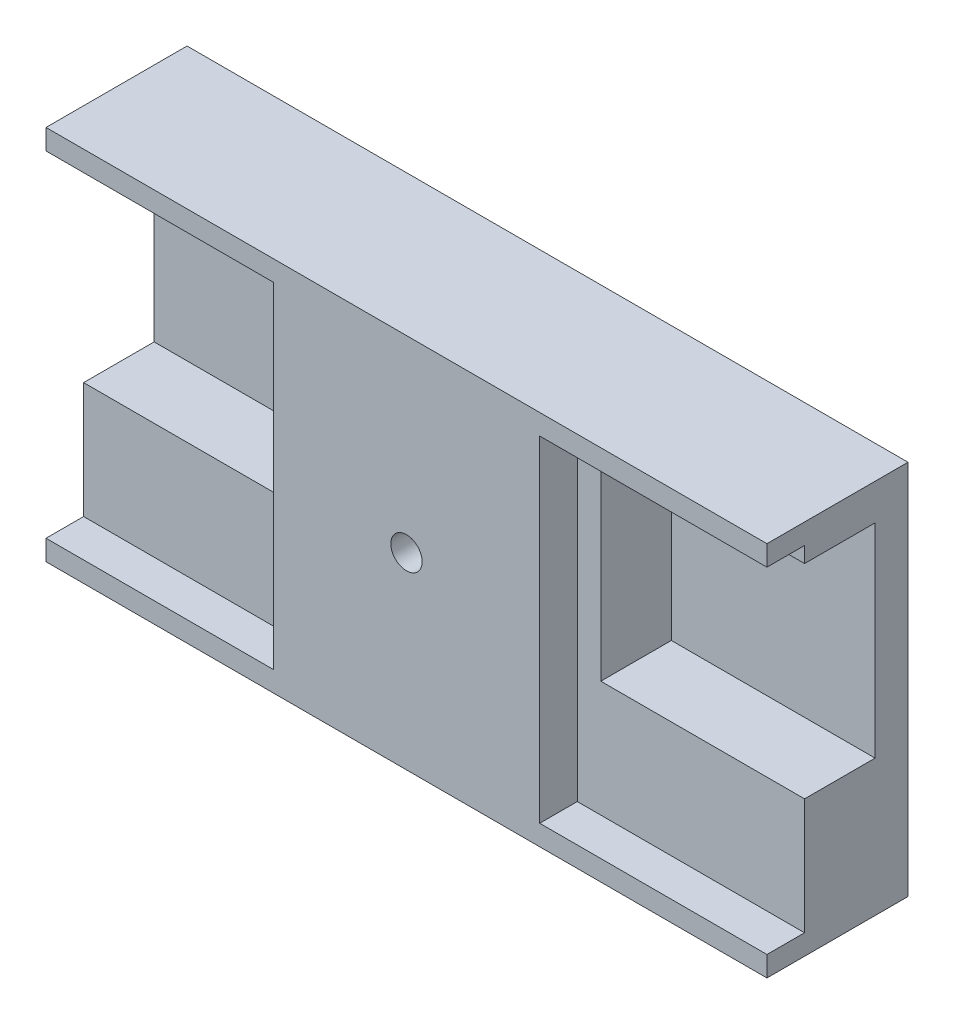
ISO-10303-21;
HEADER;
FILE_DESCRIPTION(('STEP AP214'),'2;1');
FILE_NAME('part.step','',(''),(''),'','','');
FILE_SCHEMA(('AUTOMOTIVE_DESIGN { 1 0 10303 214 1 1 1 1 }'));
ENDSEC;
DATA;
#1=APPLICATION_CONTEXT('core data for automotive mechanical design processes');
#2=APPLICATION_PROTOCOL_DEFINITION('international standard','automotive_design',2000,#1);
#3=PRODUCT_CONTEXT('',#1,'mechanical');
#4=PRODUCT('Part','Part','',(#3));
#5=PRODUCT_RELATED_PRODUCT_CATEGORY('part','',(#4));
#6=PRODUCT_DEFINITION_FORMATION('','',#4);
#7=PRODUCT_DEFINITION_CONTEXT('part definition',#1,'design');
#8=PRODUCT_DEFINITION('design','',#6,#7);
#9=PRODUCT_DEFINITION_SHAPE('','',#8);
#10=(LENGTH_UNIT() NAMED_UNIT(*) SI_UNIT(.MILLI.,.METRE.));
#11=(NAMED_UNIT(*) PLANE_ANGLE_UNIT() SI_UNIT($,.RADIAN.));
#12=(NAMED_UNIT(*) SI_UNIT($,.STERADIAN.) SOLID_ANGLE_UNIT());
#13=UNCERTAINTY_MEASURE_WITH_UNIT(LENGTH_MEASURE(1.E-05),#10,'distance_accuracy_value','');
#14=(GEOMETRIC_REPRESENTATION_CONTEXT(3) GLOBAL_UNCERTAINTY_ASSIGNED_CONTEXT((#13)) GLOBAL_UNIT_ASSIGNED_CONTEXT((#10,
#11,#12)) REPRESENTATION_CONTEXT('',''));
#15=CARTESIAN_POINT('',(0.,0.,0.));
#16=DIRECTION('',(0.,0.,1.));
#17=DIRECTION('',(1.,0.,0.));
#18=AXIS2_PLACEMENT_3D('',#15,#16,#17);
#19=CARTESIAN_POINT('',(-23.1069182389937,-3.11949685534593,9.));
#20=DIRECTION('',(1.,0.,0.));
#21=DIRECTION('',(0.,0.,-1.));
#22=AXIS2_PLACEMENT_3D('',#19,#20,#21);
#23=PLANE('',#22);
#24=DIRECTION('',(0.,-1.,0.));
#25=VECTOR('',#24,1.);
#26=CARTESIAN_POINT('',(-23.1069182389937,-3.11949685534593,2.1));
#27=LINE('',#26,#25);
#28=CARTESIAN_POINT('',(-23.1069182389937,18.5805031446541,2.1));
#29=VERTEX_POINT('',#28);
#30=CARTESIAN_POINT('',(-23.1069182389937,5.58050314465406,2.1));
#31=VERTEX_POINT('',#30);
#32=EDGE_CURVE('E325',#29,#31,#27,.T.);
#33=ORIENTED_EDGE('',*,*,#32,.F.);
#34=DIRECTION('',(0.,0.,1.));
#35=VECTOR('',#34,1.);
#36=CARTESIAN_POINT('',(-23.1069182389937,18.5805031446541,9.));
#37=LINE('',#36,#35);
#38=CARTESIAN_POINT('',(-23.1069182389937,18.5805031446541,6.6));
#39=VERTEX_POINT('',#38);
#40=EDGE_CURVE('E219',#29,#39,#37,.T.);
#41=ORIENTED_EDGE('',*,*,#40,.T.);
#42=DIRECTION('',(0.,-1.,0.));
#43=VECTOR('',#42,1.);
#44=CARTESIAN_POINT('',(-23.1069182389937,-3.11949685534593,6.6));
#45=LINE('',#44,#43);
#46=CARTESIAN_POINT('',(-23.1069182389937,19.5805031446541,6.6));
#47=VERTEX_POINT('',#46);
#48=EDGE_CURVE('E313',#47,#39,#45,.T.);
#49=ORIENTED_EDGE('',*,*,#48,.F.);
#50=DIRECTION('',(0.,0.,1.));
#51=VECTOR('',#50,1.);
#52=CARTESIAN_POINT('',(-23.1069182389937,19.5805031446541,9.));
#53=LINE('',#52,#51);
#54=CARTESIAN_POINT('',(-23.1069182389937,19.5805031446541,9.));
#55=VERTEX_POINT('',#54);
#56=EDGE_CURVE('E267',#47,#55,#53,.T.);
#57=ORIENTED_EDGE('',*,*,#56,.T.);
#58=DIRECTION('',(0.,-1.,0.));
#59=VECTOR('',#58,1.);
#60=CARTESIAN_POINT('',(-23.1069182389937,-3.11949685534593,9.));
#61=LINE('',#60,#59);
#62=CARTESIAN_POINT('',(-23.1069182389937,20.8805031446541,9.));
#63=VERTEX_POINT('',#62);
#64=EDGE_CURVE('E274',#63,#55,#61,.T.);
#65=ORIENTED_EDGE('',*,*,#64,.F.);
#66=DIRECTION('',(0.,0.,-1.));
#67=VECTOR('',#66,1.);
#68=CARTESIAN_POINT('',(-23.1069182389937,20.8805031446541,9.));
#69=LINE('',#68,#67);
#70=CARTESIAN_POINT('',(-23.1069182389937,20.8805031446541,0.));
#71=VERTEX_POINT('',#70);
#72=EDGE_CURVE('E286',#63,#71,#69,.T.);
#73=ORIENTED_EDGE('',*,*,#72,.T.);
#74=DIRECTION('',(0.,-1.,0.));
#75=VECTOR('',#74,1.);
#76=CARTESIAN_POINT('',(-23.1069182389937,-3.11949685534593,0.));
#77=LINE('',#76,#75);
#78=CARTESIAN_POINT('',(-23.1069182389937,-3.11949685534593,0.));
#79=VERTEX_POINT('',#78);
#80=EDGE_CURVE('E287',#71,#79,#77,.T.);
#81=ORIENTED_EDGE('',*,*,#80,.T.);
#82=DIRECTION('',(0.,0.,-1.));
#83=VECTOR('',#82,1.);
#84=CARTESIAN_POINT('',(-23.1069182389937,-3.11949685534593,9.));
#85=LINE('',#84,#83);
#86=CARTESIAN_POINT('',(-23.1069182389937,-3.11949685534593,9.));
#87=VERTEX_POINT('',#86);
#88=EDGE_CURVE('E304',#87,#79,#85,.T.);
#89=ORIENTED_EDGE('',*,*,#88,.F.);
#90=CARTESIAN_POINT('',(-23.1069182389937,-1.81949685534593,9.));
#91=VERTEX_POINT('',#90);
#92=EDGE_CURVE('E278',#91,#87,#61,.T.);
#93=ORIENTED_EDGE('',*,*,#92,.F.);
#94=DIRECTION('',(0.,0.,-1.));
#95=VECTOR('',#94,1.);
#96=CARTESIAN_POINT('',(-23.1069182389937,-1.81949685534593,9.));
#97=LINE('',#96,#95);
#98=CARTESIAN_POINT('',(-23.1069182389937,-1.81949685534593,6.6));
#99=VERTEX_POINT('',#98);
#100=EDGE_CURVE('E262',#91,#99,#97,.T.);
#101=ORIENTED_EDGE('',*,*,#100,.T.);
#102=CARTESIAN_POINT('',(-23.1069182389937,5.58050314465406,6.6));
#103=VERTEX_POINT('',#102);
#104=EDGE_CURVE('E312',#103,#99,#45,.T.);
#105=ORIENTED_EDGE('',*,*,#104,.F.);
#106=DIRECTION('',(0.,0.,-1.));
#107=VECTOR('',#106,1.);
#108=CARTESIAN_POINT('',(-23.1069182389937,5.58050314465406,9.));
#109=LINE('',#108,#107);
#110=EDGE_CURVE('E55',#103,#31,#109,.T.);
#111=ORIENTED_EDGE('',*,*,#110,.T.);
#112=EDGE_LOOP('',(#33,#41,#49,#57,#65,#73,#81,#89,#93,#101,#105,#111));
#113=FACE_BOUND('',#112,.T.);
#114=ADVANCED_FACE('F33',(#113),#23,.F.);
#115=CARTESIAN_POINT('',(-23.1069182389937,-3.11949685534593,9.));
#116=DIRECTION('',(0.,1.,0.));
#117=DIRECTION('',(0.,0.,1.));
#118=AXIS2_PLACEMENT_3D('',#115,#116,#117);
#119=PLANE('',#118);
#120=DIRECTION('',(1.,0.,0.));
#121=VECTOR('',#120,1.);
#122=CARTESIAN_POINT('',(-23.1069182389937,-3.11949685534593,0.));
#123=LINE('',#122,#121);
#124=CARTESIAN_POINT('',(22.8930817610063,-3.11949685534593,0.));
#125=VERTEX_POINT('',#124);
#126=EDGE_CURVE('E290',#79,#125,#123,.T.);
#127=ORIENTED_EDGE('',*,*,#126,.T.);
#128=DIRECTION('',(0.,0.,-1.));
#129=VECTOR('',#128,1.);
#130=CARTESIAN_POINT('',(22.8930817610063,-3.11949685534593,9.));
#131=LINE('',#130,#129);
#132=CARTESIAN_POINT('',(22.8930817610063,-3.11949685534593,9.));
#133=VERTEX_POINT('',#132);
#134=EDGE_CURVE('E301',#133,#125,#131,.T.);
#135=ORIENTED_EDGE('',*,*,#134,.F.);
#136=DIRECTION('',(1.,0.,0.));
#137=VECTOR('',#136,1.);
#138=CARTESIAN_POINT('',(-23.1069182389937,-3.11949685534593,9.));
#139=LINE('',#138,#137);
#140=EDGE_CURVE('E277',#87,#133,#139,.T.);
#141=ORIENTED_EDGE('',*,*,#140,.F.);
#142=ORIENTED_EDGE('',*,*,#88,.T.);
#143=EDGE_LOOP('',(#127,#135,#141,#142));
#144=FACE_BOUND('',#143,.T.);
#145=ADVANCED_FACE('F355',(#144),#119,.F.);
#146=CARTESIAN_POINT('',(22.8930817610063,-3.11949685534593,9.));
#147=DIRECTION('',(-1.,0.,0.));
#148=DIRECTION('',(0.,0.,1.));
#149=AXIS2_PLACEMENT_3D('',#146,#147,#148);
#150=PLANE('',#149);
#151=DIRECTION('',(0.,-1.,0.));
#152=VECTOR('',#151,1.);
#153=CARTESIAN_POINT('',(22.8930817610063,-3.11949685534593,6.6));
#154=LINE('',#153,#152);
#155=CARTESIAN_POINT('',(22.8930817610063,19.5805031446541,6.6));
#156=VERTEX_POINT('',#155);
#157=CARTESIAN_POINT('',(22.8930817610063,18.5805031446541,6.6));
#158=VERTEX_POINT('',#157);
#159=EDGE_CURVE('E320',#156,#158,#154,.T.);
#160=ORIENTED_EDGE('',*,*,#159,.T.);
#161=DIRECTION('',(0.,0.,-1.));
#162=VECTOR('',#161,1.);
#163=CARTESIAN_POINT('',(22.8930817610063,18.5805031446541,9.));
#164=LINE('',#163,#162);
#165=CARTESIAN_POINT('',(22.8930817610063,18.5805031446541,2.1));
#166=VERTEX_POINT('',#165);
#167=EDGE_CURVE('E198',#158,#166,#164,.T.);
#168=ORIENTED_EDGE('',*,*,#167,.T.);
#169=DIRECTION('',(0.,1.,0.));
#170=VECTOR('',#169,1.);
#171=CARTESIAN_POINT('',(22.8930817610063,-3.11949685534593,2.1));
#172=LINE('',#171,#170);
#173=CARTESIAN_POINT('',(22.8930817610063,5.58050314465406,2.1));
#174=VERTEX_POINT('',#173);
#175=EDGE_CURVE('E11',#174,#166,#172,.T.);
#176=ORIENTED_EDGE('',*,*,#175,.F.);
#177=DIRECTION('',(0.,0.,1.));
#178=VECTOR('',#177,1.);
#179=CARTESIAN_POINT('',(22.8930817610063,5.58050314465406,9.));
#180=LINE('',#179,#178);
#181=CARTESIAN_POINT('',(22.8930817610063,5.58050314465406,6.6));
#182=VERTEX_POINT('',#181);
#183=EDGE_CURVE('E194',#174,#182,#180,.T.);
#184=ORIENTED_EDGE('',*,*,#183,.T.);
#185=CARTESIAN_POINT('',(22.8930817610063,-1.81949685534592,6.6));
#186=VERTEX_POINT('',#185);
#187=EDGE_CURVE('E319',#182,#186,#154,.T.);
#188=ORIENTED_EDGE('',*,*,#187,.T.);
#189=DIRECTION('',(0.,0.,1.));
#190=VECTOR('',#189,1.);
#191=CARTESIAN_POINT('',(22.8930817610063,-1.81949685534592,9.));
#192=LINE('',#191,#190);
#193=CARTESIAN_POINT('',(22.8930817610063,-1.81949685534592,9.));
#194=VERTEX_POINT('',#193);
#195=EDGE_CURVE('E243',#186,#194,#192,.T.);
#196=ORIENTED_EDGE('',*,*,#195,.T.);
#197=DIRECTION('',(0.,1.,0.));
#198=VECTOR('',#197,1.);
#199=CARTESIAN_POINT('',(22.8930817610063,-3.11949685534593,9.));
#200=LINE('',#199,#198);
#201=EDGE_CURVE('E281',#133,#194,#200,.T.);
#202=ORIENTED_EDGE('',*,*,#201,.F.);
#203=ORIENTED_EDGE('',*,*,#134,.T.);
#204=DIRECTION('',(0.,1.,0.));
#205=VECTOR('',#204,1.);
#206=CARTESIAN_POINT('',(22.8930817610063,-3.11949685534593,0.));
#207=LINE('',#206,#205);
#208=CARTESIAN_POINT('',(22.8930817610063,20.8805031446541,0.));
#209=VERTEX_POINT('',#208);
#210=EDGE_CURVE('E292',#125,#209,#207,.T.);
#211=ORIENTED_EDGE('',*,*,#210,.T.);
#212=DIRECTION('',(0.,0.,-1.));
#213=VECTOR('',#212,1.);
#214=CARTESIAN_POINT('',(22.8930817610063,20.8805031446541,9.));
#215=LINE('',#214,#213);
#216=CARTESIAN_POINT('',(22.8930817610063,20.8805031446541,9.));
#217=VERTEX_POINT('',#216);
#218=EDGE_CURVE('E298',#217,#209,#215,.T.);
#219=ORIENTED_EDGE('',*,*,#218,.F.);
#220=CARTESIAN_POINT('',(22.8930817610063,19.5805031446541,9.));
#221=VERTEX_POINT('',#220);
#222=EDGE_CURVE('E280',#221,#217,#200,.T.);
#223=ORIENTED_EDGE('',*,*,#222,.F.);
#224=DIRECTION('',(0.,0.,-1.));
#225=VECTOR('',#224,1.);
#226=CARTESIAN_POINT('',(22.8930817610063,19.5805031446541,9.));
#227=LINE('',#226,#225);
#228=EDGE_CURVE('E238',#221,#156,#227,.T.);
#229=ORIENTED_EDGE('',*,*,#228,.T.);
#230=EDGE_LOOP('',(#160,#168,#176,#184,#188,#196,#202,#203,#211,#219,#223,#229));
#231=FACE_BOUND('',#230,.T.);
#232=ADVANCED_FACE('F331',(#231),#150,.F.);
#233=CARTESIAN_POINT('',(-23.1069182389937,20.8805031446541,9.));
#234=DIRECTION('',(0.,-1.,0.));
#235=DIRECTION('',(0.,0.,-1.));
#236=AXIS2_PLACEMENT_3D('',#233,#234,#235);
#237=PLANE('',#236);
#238=DIRECTION('',(-1.,0.,0.));
#239=VECTOR('',#238,1.);
#240=CARTESIAN_POINT('',(-23.1069182389937,20.8805031446541,0.));
#241=LINE('',#240,#239);
#242=EDGE_CURVE('E294',#209,#71,#241,.T.);
#243=ORIENTED_EDGE('',*,*,#242,.T.);
#244=ORIENTED_EDGE('',*,*,#72,.F.);
#245=DIRECTION('',(-1.,0.,0.));
#246=VECTOR('',#245,1.);
#247=CARTESIAN_POINT('',(-23.1069182389937,20.8805031446541,9.));
#248=LINE('',#247,#246);
#249=EDGE_CURVE('E284',#217,#63,#248,.T.);
#250=ORIENTED_EDGE('',*,*,#249,.F.);
#251=ORIENTED_EDGE('',*,*,#218,.T.);
#252=EDGE_LOOP('',(#243,#244,#250,#251));
#253=FACE_BOUND('',#252,.T.);
#254=ADVANCED_FACE('F363',(#253),#237,.F.);
#255=CARTESIAN_POINT('',(0.,0.,9.));
#256=DIRECTION('',(0.,0.,-1.));
#257=DIRECTION('',(-1.,0.,0.));
#258=AXIS2_PLACEMENT_3D('',#255,#256,#257);
#259=PLANE('',#258);
#260=CARTESIAN_POINT('',(-0.106918238993703,8.88050314465407,9.));
#261=DIRECTION('',(0.,0.,1.));
#262=DIRECTION('',(1.,0.,0.));
#263=AXIS2_PLACEMENT_3D('',#260,#261,#262);
#264=CIRCLE('',#263,1.);
#265=CARTESIAN_POINT('',(0.893081761006298,8.88050314465407,9.));
#266=VERTEX_POINT('',#265);
#267=EDGE_CURVE('E270',#266,#266,#264,.T.);
#268=ORIENTED_EDGE('',*,*,#267,.F.);
#269=EDGE_LOOP('',(#268));
#270=FACE_BOUND('',#269,.T.);
#271=ORIENTED_EDGE('',*,*,#201,.T.);
#272=DIRECTION('',(1.,0.,0.));
#273=VECTOR('',#272,1.);
#274=CARTESIAN_POINT('',(23.9930817610063,-1.81949685534592,9.));
#275=LINE('',#274,#273);
#276=CARTESIAN_POINT('',(8.39308176100631,-1.81949685534592,9.));
#277=VERTEX_POINT('',#276);
#278=EDGE_CURVE('E226',#277,#194,#275,.T.);
#279=ORIENTED_EDGE('',*,*,#278,.F.);
#280=DIRECTION('',(0.,-1.,0.));
#281=VECTOR('',#280,1.);
#282=CARTESIAN_POINT('',(8.3930817610063,19.5805031446541,9.));
#283=LINE('',#282,#281);
#284=CARTESIAN_POINT('',(8.3930817610063,19.5805031446541,9.));
#285=VERTEX_POINT('',#284);
#286=EDGE_CURVE('E222',#285,#277,#283,.T.);
#287=ORIENTED_EDGE('',*,*,#286,.F.);
#288=DIRECTION('',(1.,0.,0.));
#289=VECTOR('',#288,1.);
#290=CARTESIAN_POINT('',(0.,19.5805031446541,9.));
#291=LINE('',#290,#289);
#292=EDGE_CURVE('E316',#285,#221,#291,.T.);
#293=ORIENTED_EDGE('',*,*,#292,.T.);
#294=ORIENTED_EDGE('',*,*,#222,.T.);
#295=ORIENTED_EDGE('',*,*,#249,.T.);
#296=ORIENTED_EDGE('',*,*,#64,.T.);
#297=DIRECTION('',(-1.,0.,0.));
#298=VECTOR('',#297,1.);
#299=CARTESIAN_POINT('',(-24.2069182389937,19.5805031446541,9.));
#300=LINE('',#299,#298);
#301=CARTESIAN_POINT('',(-8.60691823899371,19.5805031446541,9.));
#302=VERTEX_POINT('',#301);
#303=EDGE_CURVE('E250',#302,#55,#300,.T.);
#304=ORIENTED_EDGE('',*,*,#303,.F.);
#305=DIRECTION('',(0.,1.,0.));
#306=VECTOR('',#305,1.);
#307=CARTESIAN_POINT('',(-8.60691823899371,19.5805031446541,9.));
#308=LINE('',#307,#306);
#309=CARTESIAN_POINT('',(-8.6069182389937,-1.81949685534593,9.));
#310=VERTEX_POINT('',#309);
#311=EDGE_CURVE('E246',#310,#302,#308,.T.);
#312=ORIENTED_EDGE('',*,*,#311,.F.);
#313=DIRECTION('',(-1.,0.,0.));
#314=VECTOR('',#313,1.);
#315=CARTESIAN_POINT('',(0.,-1.81949685534592,9.));
#316=LINE('',#315,#314);
#317=EDGE_CURVE('E307',#310,#91,#316,.T.);
#318=ORIENTED_EDGE('',*,*,#317,.T.);
#319=ORIENTED_EDGE('',*,*,#92,.T.);
#320=ORIENTED_EDGE('',*,*,#140,.T.);
#321=EDGE_LOOP('',(#271,#279,#287,#293,#294,#295,#296,#304,#312,#318,#319,#320));
#322=FACE_BOUND('',#321,.T.);
#323=ADVANCED_FACE('F339',(#270,#322),#259,.F.);
#324=CARTESIAN_POINT('',(0.,0.,0.));
#325=DIRECTION('',(0.,0.,-1.));
#326=DIRECTION('',(-1.,0.,0.));
#327=AXIS2_PLACEMENT_3D('',#324,#325,#326);
#328=PLANE('',#327);
#329=CARTESIAN_POINT('',(-0.106918238993703,8.88050314465407,0.));
#330=DIRECTION('',(0.,0.,-1.));
#331=DIRECTION('',(-1.,0.,0.));
#332=AXIS2_PLACEMENT_3D('',#329,#330,#331);
#333=CIRCLE('',#332,1.);
#334=CARTESIAN_POINT('',(-1.1069182389937,8.88050314465407,0.));
#335=VERTEX_POINT('',#334);
#336=EDGE_CURVE('E273',#335,#335,#333,.T.);
#337=ORIENTED_EDGE('',*,*,#336,.F.);
#338=EDGE_LOOP('',(#337));
#339=FACE_BOUND('',#338,.T.);
#340=ORIENTED_EDGE('',*,*,#80,.F.);
#341=ORIENTED_EDGE('',*,*,#242,.F.);
#342=ORIENTED_EDGE('',*,*,#210,.F.);
#343=ORIENTED_EDGE('',*,*,#126,.F.);
#344=EDGE_LOOP('',(#340,#341,#342,#343));
#345=FACE_BOUND('',#344,.T.);
#346=ADVANCED_FACE('F360',(#339,#345),#328,.T.);
#347=CARTESIAN_POINT('',(-0.106918238993703,8.88050314465407,-10.));
#348=DIRECTION('',(0.,0.,1.));
#349=DIRECTION('',(1.,0.,0.));
#350=AXIS2_PLACEMENT_3D('',#347,#348,#349);
#351=CYLINDRICAL_SURFACE('',#350,1.);
#352=ORIENTED_EDGE('',*,*,#336,.T.);
#353=EDGE_LOOP('',(#352));
#354=FACE_BOUND('',#353,.T.);
#355=ORIENTED_EDGE('',*,*,#267,.T.);
#356=EDGE_LOOP('',(#355));
#357=FACE_BOUND('',#356,.T.);
#358=ADVANCED_FACE('F418',(#354,#357),#351,.F.);
#359=CARTESIAN_POINT('',(0.,0.,6.6));
#360=DIRECTION('',(0.,0.,1.));
#361=DIRECTION('',(1.,0.,0.));
#362=AXIS2_PLACEMENT_3D('',#359,#360,#361);
#363=PLANE('',#362);
#364=DIRECTION('',(-1.,0.,0.));
#365=VECTOR('',#364,1.);
#366=CARTESIAN_POINT('',(-24.1069182389937,18.5805031446541,6.6));
#367=LINE('',#366,#365);
#368=CARTESIAN_POINT('',(-10.1069182389937,18.5805031446541,6.6));
#369=VERTEX_POINT('',#368);
#370=EDGE_CURVE('E204',#369,#39,#367,.T.);
#371=ORIENTED_EDGE('',*,*,#370,.F.);
#372=DIRECTION('',(0.,1.,0.));
#373=VECTOR('',#372,1.);
#374=CARTESIAN_POINT('',(-10.1069182389937,18.5805031446541,6.6));
#375=LINE('',#374,#373);
#376=CARTESIAN_POINT('',(-10.1069182389937,5.58050314465406,6.6));
#377=VERTEX_POINT('',#376);
#378=EDGE_CURVE('E200',#377,#369,#375,.T.);
#379=ORIENTED_EDGE('',*,*,#378,.F.);
#380=DIRECTION('',(1.,0.,0.));
#381=VECTOR('',#380,1.);
#382=CARTESIAN_POINT('',(0.,5.58050314465406,6.6));
#383=LINE('',#382,#381);
#384=EDGE_CURVE('E323',#103,#377,#383,.T.);
#385=ORIENTED_EDGE('',*,*,#384,.F.);
#386=ORIENTED_EDGE('',*,*,#104,.T.);
#387=DIRECTION('',(1.,0.,0.));
#388=VECTOR('',#387,1.);
#389=CARTESIAN_POINT('',(-24.2069182389937,-1.81949685534593,6.6));
#390=LINE('',#389,#388);
#391=CARTESIAN_POINT('',(-8.6069182389937,-1.81949685534593,6.6));
#392=VERTEX_POINT('',#391);
#393=EDGE_CURVE('E247',#99,#392,#390,.T.);
#394=ORIENTED_EDGE('',*,*,#393,.T.);
#395=DIRECTION('',(0.,1.,0.));
#396=VECTOR('',#395,1.);
#397=CARTESIAN_POINT('',(-8.60691823899371,19.5805031446541,6.6));
#398=LINE('',#397,#396);
#399=CARTESIAN_POINT('',(-8.60691823899371,19.5805031446541,6.6));
#400=VERTEX_POINT('',#399);
#401=EDGE_CURVE('E249',#392,#400,#398,.T.);
#402=ORIENTED_EDGE('',*,*,#401,.T.);
#403=DIRECTION('',(-1.,0.,0.));
#404=VECTOR('',#403,1.);
#405=CARTESIAN_POINT('',(-24.2069182389937,19.5805031446541,6.6));
#406=LINE('',#405,#404);
#407=EDGE_CURVE('E253',#400,#47,#406,.T.);
#408=ORIENTED_EDGE('',*,*,#407,.T.);
#409=ORIENTED_EDGE('',*,*,#48,.T.);
#410=EDGE_LOOP('',(#371,#379,#385,#386,#394,#402,#408,#409));
#411=FACE_BOUND('',#410,.T.);
#412=ADVANCED_FACE('F384',(#411),#363,.T.);
#413=CARTESIAN_POINT('',(-24.2069182389937,19.5805031446541,6.6));
#414=DIRECTION('',(0.,1.,0.));
#415=DIRECTION('',(0.,0.,1.));
#416=AXIS2_PLACEMENT_3D('',#413,#414,#415);
#417=PLANE('',#416);
#418=ORIENTED_EDGE('',*,*,#407,.F.);
#419=DIRECTION('',(0.,0.,1.));
#420=VECTOR('',#419,1.);
#421=CARTESIAN_POINT('',(-8.60691823899371,19.5805031446541,6.6));
#422=LINE('',#421,#420);
#423=EDGE_CURVE('E260',#400,#302,#422,.T.);
#424=ORIENTED_EDGE('',*,*,#423,.T.);
#425=ORIENTED_EDGE('',*,*,#303,.T.);
#426=ORIENTED_EDGE('',*,*,#56,.F.);
#427=EDGE_LOOP('',(#418,#424,#425,#426));
#428=FACE_BOUND('',#427,.T.);
#429=ADVANCED_FACE('F373',(#428),#417,.F.);
#430=CARTESIAN_POINT('',(-24.2069182389937,-1.81949685534593,6.6));
#431=DIRECTION('',(0.,-1.,0.));
#432=DIRECTION('',(1.,0.,0.));
#433=AXIS2_PLACEMENT_3D('',#430,#431,#432);
#434=PLANE('',#433);
#435=ORIENTED_EDGE('',*,*,#317,.F.);
#436=DIRECTION('',(0.,0.,1.));
#437=VECTOR('',#436,1.);
#438=CARTESIAN_POINT('',(-8.6069182389937,-1.81949685534593,6.6));
#439=LINE('',#438,#437);
#440=EDGE_CURVE('E256',#392,#310,#439,.T.);
#441=ORIENTED_EDGE('',*,*,#440,.F.);
#442=ORIENTED_EDGE('',*,*,#393,.F.);
#443=ORIENTED_EDGE('',*,*,#100,.F.);
#444=EDGE_LOOP('',(#435,#441,#442,#443));
#445=FACE_BOUND('',#444,.T.);
#446=ADVANCED_FACE('F380',(#445),#434,.F.);
#447=CARTESIAN_POINT('',(-8.60691823899371,19.5805031446541,6.6));
#448=DIRECTION('',(1.,0.,0.));
#449=DIRECTION('',(0.,1.,0.));
#450=AXIS2_PLACEMENT_3D('',#447,#448,#449);
#451=PLANE('',#450);
#452=ORIENTED_EDGE('',*,*,#311,.T.);
#453=ORIENTED_EDGE('',*,*,#423,.F.);
#454=ORIENTED_EDGE('',*,*,#401,.F.);
#455=ORIENTED_EDGE('',*,*,#440,.T.);
#456=EDGE_LOOP('',(#452,#453,#454,#455));
#457=FACE_BOUND('',#456,.T.);
#458=ADVANCED_FACE('F376',(#457),#451,.F.);
#459=CARTESIAN_POINT('',(0.,0.,6.6));
#460=DIRECTION('',(0.,0.,-1.));
#461=DIRECTION('',(-1.,0.,0.));
#462=AXIS2_PLACEMENT_3D('',#459,#460,#461);
#463=PLANE('',#462);
#464=DIRECTION('',(0.,-1.,0.));
#465=VECTOR('',#464,1.);
#466=CARTESIAN_POINT('',(9.8930817610063,18.5805031446541,6.6));
#467=LINE('',#466,#465);
#468=CARTESIAN_POINT('',(9.8930817610063,18.5805031446541,6.6));
#469=VERTEX_POINT('',#468);
#470=CARTESIAN_POINT('',(9.8930817610063,5.58050314465406,6.6));
#471=VERTEX_POINT('',#470);
#472=EDGE_CURVE('E191',#469,#471,#467,.T.);
#473=ORIENTED_EDGE('',*,*,#472,.F.);
#474=DIRECTION('',(1.,0.,0.));
#475=VECTOR('',#474,1.);
#476=CARTESIAN_POINT('',(0.,18.5805031446541,6.6));
#477=LINE('',#476,#475);
#478=EDGE_CURVE('E40',#469,#158,#477,.T.);
#479=ORIENTED_EDGE('',*,*,#478,.T.);
#480=ORIENTED_EDGE('',*,*,#159,.F.);
#481=DIRECTION('',(-1.,0.,0.));
#482=VECTOR('',#481,1.);
#483=CARTESIAN_POINT('',(23.9930817610063,19.5805031446541,6.6));
#484=LINE('',#483,#482);
#485=CARTESIAN_POINT('',(8.3930817610063,19.5805031446541,6.6));
#486=VERTEX_POINT('',#485);
#487=EDGE_CURVE('E223',#156,#486,#484,.T.);
#488=ORIENTED_EDGE('',*,*,#487,.T.);
#489=DIRECTION('',(0.,-1.,0.));
#490=VECTOR('',#489,1.);
#491=CARTESIAN_POINT('',(8.3930817610063,19.5805031446541,6.6));
#492=LINE('',#491,#490);
#493=CARTESIAN_POINT('',(8.39308176100631,-1.81949685534592,6.6));
#494=VERTEX_POINT('',#493);
#495=EDGE_CURVE('E225',#486,#494,#492,.T.);
#496=ORIENTED_EDGE('',*,*,#495,.T.);
#497=DIRECTION('',(1.,0.,0.));
#498=VECTOR('',#497,1.);
#499=CARTESIAN_POINT('',(23.9930817610063,-1.81949685534592,6.6));
#500=LINE('',#499,#498);
#501=EDGE_CURVE('E229',#494,#186,#500,.T.);
#502=ORIENTED_EDGE('',*,*,#501,.T.);
#503=ORIENTED_EDGE('',*,*,#187,.F.);
#504=DIRECTION('',(1.,0.,0.));
#505=VECTOR('',#504,1.);
#506=CARTESIAN_POINT('',(23.8930817610063,5.58050314465406,6.6));
#507=LINE('',#506,#505);
#508=EDGE_CURVE('E178',#471,#182,#507,.T.);
#509=ORIENTED_EDGE('',*,*,#508,.F.);
#510=EDGE_LOOP('',(#473,#479,#480,#488,#496,#502,#503,#509));
#511=FACE_BOUND('',#510,.T.);
#512=ADVANCED_FACE('F327',(#511),#463,.F.);
#513=CARTESIAN_POINT('',(23.9930817610063,-1.81949685534592,6.6));
#514=DIRECTION('',(0.,-1.,0.));
#515=DIRECTION('',(1.,0.,0.));
#516=AXIS2_PLACEMENT_3D('',#513,#514,#515);
#517=PLANE('',#516);
#518=ORIENTED_EDGE('',*,*,#501,.F.);
#519=DIRECTION('',(0.,0.,1.));
#520=VECTOR('',#519,1.);
#521=CARTESIAN_POINT('',(8.39308176100631,-1.81949685534592,6.6));
#522=LINE('',#521,#520);
#523=EDGE_CURVE('E236',#494,#277,#522,.T.);
#524=ORIENTED_EDGE('',*,*,#523,.T.);
#525=ORIENTED_EDGE('',*,*,#278,.T.);
#526=ORIENTED_EDGE('',*,*,#195,.F.);
#527=EDGE_LOOP('',(#518,#524,#525,#526));
#528=FACE_BOUND('',#527,.T.);
#529=ADVANCED_FACE('F348',(#528),#517,.F.);
#530=CARTESIAN_POINT('',(23.9930817610063,19.5805031446541,6.6));
#531=DIRECTION('',(0.,1.,0.));
#532=DIRECTION('',(0.,0.,1.));
#533=AXIS2_PLACEMENT_3D('',#530,#531,#532);
#534=PLANE('',#533);
#535=ORIENTED_EDGE('',*,*,#292,.F.);
#536=DIRECTION('',(0.,0.,1.));
#537=VECTOR('',#536,1.);
#538=CARTESIAN_POINT('',(8.3930817610063,19.5805031446541,6.6));
#539=LINE('',#538,#537);
#540=EDGE_CURVE('E232',#486,#285,#539,.T.);
#541=ORIENTED_EDGE('',*,*,#540,.F.);
#542=ORIENTED_EDGE('',*,*,#487,.F.);
#543=ORIENTED_EDGE('',*,*,#228,.F.);
#544=EDGE_LOOP('',(#535,#541,#542,#543));
#545=FACE_BOUND('',#544,.T.);
#546=ADVANCED_FACE('F335',(#545),#534,.F.);
#547=CARTESIAN_POINT('',(8.3930817610063,19.5805031446541,6.6));
#548=DIRECTION('',(-1.,0.,0.));
#549=DIRECTION('',(0.,-1.,0.));
#550=AXIS2_PLACEMENT_3D('',#547,#548,#549);
#551=PLANE('',#550);
#552=ORIENTED_EDGE('',*,*,#286,.T.);
#553=ORIENTED_EDGE('',*,*,#523,.F.);
#554=ORIENTED_EDGE('',*,*,#495,.F.);
#555=ORIENTED_EDGE('',*,*,#540,.T.);
#556=EDGE_LOOP('',(#552,#553,#554,#555));
#557=FACE_BOUND('',#556,.T.);
#558=ADVANCED_FACE('F342',(#557),#551,.F.);
#559=CARTESIAN_POINT('',(0.,0.,2.1));
#560=DIRECTION('',(0.,0.,1.));
#561=DIRECTION('',(1.,0.,0.));
#562=AXIS2_PLACEMENT_3D('',#559,#560,#561);
#563=PLANE('',#562);
#564=ORIENTED_EDGE('',*,*,#32,.T.);
#565=DIRECTION('',(1.,0.,0.));
#566=VECTOR('',#565,1.);
#567=CARTESIAN_POINT('',(-24.1069182389937,5.58050314465406,2.1));
#568=LINE('',#567,#566);
#569=CARTESIAN_POINT('',(-10.1069182389937,5.58050314465406,2.1));
#570=VERTEX_POINT('',#569);
#571=EDGE_CURVE('E201',#31,#570,#568,.T.);
#572=ORIENTED_EDGE('',*,*,#571,.T.);
#573=DIRECTION('',(0.,1.,0.));
#574=VECTOR('',#573,1.);
#575=CARTESIAN_POINT('',(-10.1069182389937,18.5805031446541,2.1));
#576=LINE('',#575,#574);
#577=CARTESIAN_POINT('',(-10.1069182389937,18.5805031446541,2.1));
#578=VERTEX_POINT('',#577);
#579=EDGE_CURVE('E203',#570,#578,#576,.T.);
#580=ORIENTED_EDGE('',*,*,#579,.T.);
#581=DIRECTION('',(-1.,0.,0.));
#582=VECTOR('',#581,1.);
#583=CARTESIAN_POINT('',(-24.1069182389937,18.5805031446541,2.1));
#584=LINE('',#583,#582);
#585=EDGE_CURVE('E207',#578,#29,#584,.T.);
#586=ORIENTED_EDGE('',*,*,#585,.T.);
#587=EDGE_LOOP('',(#564,#572,#580,#586));
#588=FACE_BOUND('',#587,.T.);
#589=ADVANCED_FACE('F393',(#588),#563,.T.);
#590=CARTESIAN_POINT('',(-24.1069182389937,18.5805031446541,2.1));
#591=DIRECTION('',(0.,1.,0.));
#592=DIRECTION('',(0.,0.,1.));
#593=AXIS2_PLACEMENT_3D('',#590,#591,#592);
#594=PLANE('',#593);
#595=ORIENTED_EDGE('',*,*,#585,.F.);
#596=DIRECTION('',(0.,0.,1.));
#597=VECTOR('',#596,1.);
#598=CARTESIAN_POINT('',(-10.1069182389937,18.5805031446541,2.1));
#599=LINE('',#598,#597);
#600=EDGE_CURVE('E214',#578,#369,#599,.T.);
#601=ORIENTED_EDGE('',*,*,#600,.T.);
#602=ORIENTED_EDGE('',*,*,#370,.T.);
#603=ORIENTED_EDGE('',*,*,#40,.F.);
#604=EDGE_LOOP('',(#595,#601,#602,#603));
#605=FACE_BOUND('',#604,.T.);
#606=ADVANCED_FACE('F395',(#605),#594,.F.);
#607=CARTESIAN_POINT('',(-24.1069182389937,5.58050314465406,2.1));
#608=DIRECTION('',(0.,-1.,0.));
#609=DIRECTION('',(0.,0.,-1.));
#610=AXIS2_PLACEMENT_3D('',#607,#608,#609);
#611=PLANE('',#610);
#612=ORIENTED_EDGE('',*,*,#384,.T.);
#613=DIRECTION('',(0.,0.,1.));
#614=VECTOR('',#613,1.);
#615=CARTESIAN_POINT('',(-10.1069182389937,5.58050314465406,2.1));
#616=LINE('',#615,#614);
#617=EDGE_CURVE('E210',#570,#377,#616,.T.);
#618=ORIENTED_EDGE('',*,*,#617,.F.);
#619=ORIENTED_EDGE('',*,*,#571,.F.);
#620=ORIENTED_EDGE('',*,*,#110,.F.);
#621=EDGE_LOOP('',(#612,#618,#619,#620));
#622=FACE_BOUND('',#621,.T.);
#623=ADVANCED_FACE('F387',(#622),#611,.F.);
#624=CARTESIAN_POINT('',(-10.1069182389937,18.5805031446541,2.1));
#625=DIRECTION('',(1.,0.,0.));
#626=DIRECTION('',(0.,1.,0.));
#627=AXIS2_PLACEMENT_3D('',#624,#625,#626);
#628=PLANE('',#627);
#629=ORIENTED_EDGE('',*,*,#378,.T.);
#630=ORIENTED_EDGE('',*,*,#600,.F.);
#631=ORIENTED_EDGE('',*,*,#579,.F.);
#632=ORIENTED_EDGE('',*,*,#617,.T.);
#633=EDGE_LOOP('',(#629,#630,#631,#632));
#634=FACE_BOUND('',#633,.T.);
#635=ADVANCED_FACE('F390',(#634),#628,.F.);
#636=CARTESIAN_POINT('',(0.,0.,2.1));
#637=DIRECTION('',(0.,0.,1.));
#638=DIRECTION('',(1.,0.,0.));
#639=AXIS2_PLACEMENT_3D('',#636,#637,#638);
#640=PLANE('',#639);
#641=ORIENTED_EDGE('',*,*,#175,.T.);
#642=DIRECTION('',(-1.,0.,0.));
#643=VECTOR('',#642,1.);
#644=CARTESIAN_POINT('',(23.8930817610063,18.5805031446541,2.1));
#645=LINE('',#644,#643);
#646=CARTESIAN_POINT('',(9.8930817610063,18.5805031446541,2.1));
#647=VERTEX_POINT('',#646);
#648=EDGE_CURVE('E171',#166,#647,#645,.T.);
#649=ORIENTED_EDGE('',*,*,#648,.T.);
#650=DIRECTION('',(0.,-1.,0.));
#651=VECTOR('',#650,1.);
#652=CARTESIAN_POINT('',(9.8930817610063,18.5805031446541,2.1));
#653=LINE('',#652,#651);
#654=CARTESIAN_POINT('',(9.8930817610063,5.58050314465406,2.1));
#655=VERTEX_POINT('',#654);
#656=EDGE_CURVE('E174',#647,#655,#653,.T.);
#657=ORIENTED_EDGE('',*,*,#656,.T.);
#658=DIRECTION('',(1.,0.,0.));
#659=VECTOR('',#658,1.);
#660=CARTESIAN_POINT('',(23.8930817610063,5.58050314465406,2.1));
#661=LINE('',#660,#659);
#662=EDGE_CURVE('E184',#655,#174,#661,.T.);
#663=ORIENTED_EDGE('',*,*,#662,.T.);
#664=EDGE_LOOP('',(#641,#649,#657,#663));
#665=FACE_BOUND('',#664,.T.);
#666=ADVANCED_FACE('F172',(#665),#640,.T.);
#667=CARTESIAN_POINT('',(23.8930817610063,18.5805031446541,2.1));
#668=DIRECTION('',(0.,1.,0.));
#669=DIRECTION('',(0.,0.,1.));
#670=AXIS2_PLACEMENT_3D('',#667,#668,#669);
#671=PLANE('',#670);
#672=ORIENTED_EDGE('',*,*,#478,.F.);
#673=DIRECTION('',(0.,0.,1.));
#674=VECTOR('',#673,1.);
#675=CARTESIAN_POINT('',(9.8930817610063,18.5805031446541,2.1));
#676=LINE('',#675,#674);
#677=EDGE_CURVE('E47',#647,#469,#676,.T.);
#678=ORIENTED_EDGE('',*,*,#677,.F.);
#679=ORIENTED_EDGE('',*,*,#648,.F.);
#680=ORIENTED_EDGE('',*,*,#167,.F.);
#681=EDGE_LOOP('',(#672,#678,#679,#680));
#682=FACE_BOUND('',#681,.T.);
#683=ADVANCED_FACE('F180',(#682),#671,.F.);
#684=CARTESIAN_POINT('',(23.8930817610063,5.58050314465406,2.1));
#685=DIRECTION('',(0.,-1.,0.));
#686=DIRECTION('',(0.,0.,-1.));
#687=AXIS2_PLACEMENT_3D('',#684,#685,#686);
#688=PLANE('',#687);
#689=ORIENTED_EDGE('',*,*,#662,.F.);
#690=DIRECTION('',(0.,0.,1.));
#691=VECTOR('',#690,1.);
#692=CARTESIAN_POINT('',(9.8930817610063,5.58050314465406,2.1));
#693=LINE('',#692,#691);
#694=EDGE_CURVE('E183',#655,#471,#693,.T.);
#695=ORIENTED_EDGE('',*,*,#694,.T.);
#696=ORIENTED_EDGE('',*,*,#508,.T.);
#697=ORIENTED_EDGE('',*,*,#183,.F.);
#698=EDGE_LOOP('',(#689,#695,#696,#697));
#699=FACE_BOUND('',#698,.T.);
#700=ADVANCED_FACE('F449',(#699),#688,.F.);
#701=CARTESIAN_POINT('',(9.8930817610063,18.5805031446541,2.1));
#702=DIRECTION('',(-1.,0.,0.));
#703=DIRECTION('',(0.,-1.,0.));
#704=AXIS2_PLACEMENT_3D('',#701,#702,#703);
#705=PLANE('',#704);
#706=ORIENTED_EDGE('',*,*,#472,.T.);
#707=ORIENTED_EDGE('',*,*,#694,.F.);
#708=ORIENTED_EDGE('',*,*,#656,.F.);
#709=ORIENTED_EDGE('',*,*,#677,.T.);
#710=EDGE_LOOP('',(#706,#707,#708,#709));
#711=FACE_BOUND('',#710,.T.);
#712=ADVANCED_FACE('F186',(#711),#705,.F.);
#713=CLOSED_SHELL('',(#114,#145,#232,#254,#323,#346,#358,#412,#429,#446,#458,#512,#529,#546,
#558,#589,#606,#623,#635,#666,#683,#700,#712));
#714=MANIFOLD_SOLID_BREP('B2',#713);
#715=ADVANCED_BREP_SHAPE_REPRESENTATION('',(#18,#714),#14);
#716=SHAPE_DEFINITION_REPRESENTATION(#9,#715);
ENDSEC;
END-ISO-10303-21;
